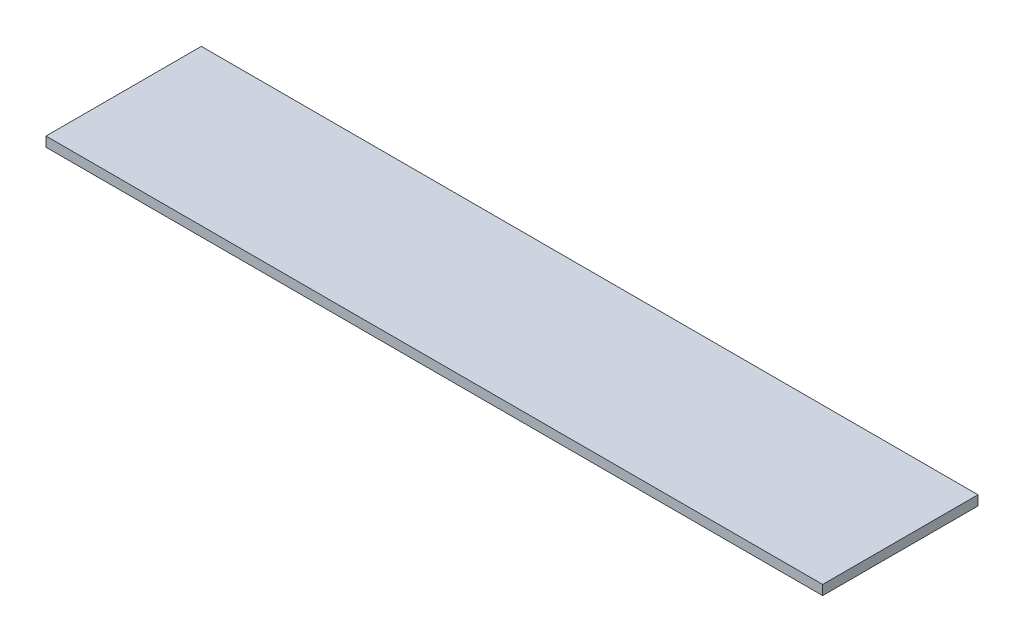
ISO-10303-21;
HEADER;
FILE_DESCRIPTION(('STEP AP214'),'2;1');
FILE_NAME('part.step','',(''),(''),'','','');
FILE_SCHEMA(('AUTOMOTIVE_DESIGN { 1 0 10303 214 1 1 1 1 }'));
ENDSEC;
DATA;
#1=APPLICATION_CONTEXT('core data for automotive mechanical design processes');
#2=APPLICATION_PROTOCOL_DEFINITION('international standard','automotive_design',2000,#1);
#3=PRODUCT_CONTEXT('',#1,'mechanical');
#4=PRODUCT('Part','Part','',(#3));
#5=PRODUCT_RELATED_PRODUCT_CATEGORY('part','',(#4));
#6=PRODUCT_DEFINITION_FORMATION('','',#4);
#7=PRODUCT_DEFINITION_CONTEXT('part definition',#1,'design');
#8=PRODUCT_DEFINITION('design','',#6,#7);
#9=PRODUCT_DEFINITION_SHAPE('','',#8);
#10=(LENGTH_UNIT() NAMED_UNIT(*) SI_UNIT(.MILLI.,.METRE.));
#11=(NAMED_UNIT(*) PLANE_ANGLE_UNIT() SI_UNIT($,.RADIAN.));
#12=(NAMED_UNIT(*) SI_UNIT($,.STERADIAN.) SOLID_ANGLE_UNIT());
#13=UNCERTAINTY_MEASURE_WITH_UNIT(LENGTH_MEASURE(1.E-05),#10,'distance_accuracy_value','');
#14=(GEOMETRIC_REPRESENTATION_CONTEXT(3) GLOBAL_UNCERTAINTY_ASSIGNED_CONTEXT((#13)) GLOBAL_UNIT_ASSIGNED_CONTEXT((#10,
#11,#12)) REPRESENTATION_CONTEXT('',''));
#15=CARTESIAN_POINT('',(0.,0.,0.));
#16=DIRECTION('',(0.,0.,1.));
#17=DIRECTION('',(1.,0.,0.));
#18=AXIS2_PLACEMENT_3D('',#15,#16,#17);
#19=CARTESIAN_POINT('',(40.,0.5,4.));
#20=DIRECTION('',(-1.,0.,0.));
#21=DIRECTION('',(0.,0.,1.));
#22=AXIS2_PLACEMENT_3D('',#19,#20,#21);
#23=PLANE('',#22);
#24=DIRECTION('',(0.,0.,-1.));
#25=VECTOR('',#24,1.);
#26=CARTESIAN_POINT('',(40.,0.,4.));
#27=LINE('',#26,#25);
#28=CARTESIAN_POINT('',(40.,0.,4.));
#29=VERTEX_POINT('',#28);
#30=CARTESIAN_POINT('',(40.,0.,-4.));
#31=VERTEX_POINT('',#30);
#32=EDGE_CURVE('E102',#29,#31,#27,.T.);
#33=ORIENTED_EDGE('',*,*,#32,.T.);
#34=DIRECTION('',(0.,-1.,0.));
#35=VECTOR('',#34,1.);
#36=CARTESIAN_POINT('',(40.,0.5,-4.));
#37=LINE('',#36,#35);
#38=CARTESIAN_POINT('',(40.,0.5,-4.));
#39=VERTEX_POINT('',#38);
#40=EDGE_CURVE('E11',#39,#31,#37,.T.);
#41=ORIENTED_EDGE('',*,*,#40,.F.);
#42=DIRECTION('',(0.,0.,-1.));
#43=VECTOR('',#42,1.);
#44=CARTESIAN_POINT('',(40.,0.5,4.));
#45=LINE('',#44,#43);
#46=CARTESIAN_POINT('',(40.,0.5,4.));
#47=VERTEX_POINT('',#46);
#48=EDGE_CURVE('E90',#47,#39,#45,.T.);
#49=ORIENTED_EDGE('',*,*,#48,.F.);
#50=DIRECTION('',(0.,-1.,0.));
#51=VECTOR('',#50,1.);
#52=CARTESIAN_POINT('',(40.,0.5,4.));
#53=LINE('',#52,#51);
#54=EDGE_CURVE('E98',#47,#29,#53,.T.);
#55=ORIENTED_EDGE('',*,*,#54,.T.);
#56=EDGE_LOOP('',(#33,#41,#49,#55));
#57=FACE_BOUND('',#56,.T.);
#58=ADVANCED_FACE('F39',(#57),#23,.F.);
#59=CARTESIAN_POINT('',(0.,0.5,-4.));
#60=DIRECTION('',(0.,0.,1.));
#61=DIRECTION('',(1.,0.,0.));
#62=AXIS2_PLACEMENT_3D('',#59,#60,#61);
#63=PLANE('',#62);
#64=DIRECTION('',(-1.,0.,0.));
#65=VECTOR('',#64,1.);
#66=CARTESIAN_POINT('',(0.,0.,-4.));
#67=LINE('',#66,#65);
#68=CARTESIAN_POINT('',(0.,0.,-4.));
#69=VERTEX_POINT('',#68);
#70=EDGE_CURVE('E94',#31,#69,#67,.T.);
#71=ORIENTED_EDGE('',*,*,#70,.T.);
#72=DIRECTION('',(0.,-1.,0.));
#73=VECTOR('',#72,1.);
#74=CARTESIAN_POINT('',(0.,0.5,-4.));
#75=LINE('',#74,#73);
#76=CARTESIAN_POINT('',(0.,0.5,-4.));
#77=VERTEX_POINT('',#76);
#78=EDGE_CURVE('E47',#77,#69,#75,.T.);
#79=ORIENTED_EDGE('',*,*,#78,.F.);
#80=DIRECTION('',(-1.,0.,0.));
#81=VECTOR('',#80,1.);
#82=CARTESIAN_POINT('',(0.,0.5,-4.));
#83=LINE('',#82,#81);
#84=EDGE_CURVE('E85',#39,#77,#83,.T.);
#85=ORIENTED_EDGE('',*,*,#84,.F.);
#86=ORIENTED_EDGE('',*,*,#40,.T.);
#87=EDGE_LOOP('',(#71,#79,#85,#86));
#88=FACE_BOUND('',#87,.T.);
#89=ADVANCED_FACE('F93',(#88),#63,.F.);
#90=CARTESIAN_POINT('',(0.,0.5,4.));
#91=DIRECTION('',(1.,0.,0.));
#92=DIRECTION('',(0.,0.,-1.));
#93=AXIS2_PLACEMENT_3D('',#90,#91,#92);
#94=PLANE('',#93);
#95=DIRECTION('',(0.,0.,1.));
#96=VECTOR('',#95,1.);
#97=CARTESIAN_POINT('',(0.,0.,4.));
#98=LINE('',#97,#96);
#99=CARTESIAN_POINT('',(0.,0.,4.));
#100=VERTEX_POINT('',#99);
#101=EDGE_CURVE('E72',#69,#100,#98,.T.);
#102=ORIENTED_EDGE('',*,*,#101,.T.);
#103=DIRECTION('',(0.,-1.,0.));
#104=VECTOR('',#103,1.);
#105=CARTESIAN_POINT('',(0.,0.5,4.));
#106=LINE('',#105,#104);
#107=CARTESIAN_POINT('',(0.,0.5,4.));
#108=VERTEX_POINT('',#107);
#109=EDGE_CURVE('E95',#108,#100,#106,.T.);
#110=ORIENTED_EDGE('',*,*,#109,.F.);
#111=DIRECTION('',(0.,0.,1.));
#112=VECTOR('',#111,1.);
#113=CARTESIAN_POINT('',(0.,0.5,4.));
#114=LINE('',#113,#112);
#115=EDGE_CURVE('E88',#77,#108,#114,.T.);
#116=ORIENTED_EDGE('',*,*,#115,.F.);
#117=ORIENTED_EDGE('',*,*,#78,.T.);
#118=EDGE_LOOP('',(#102,#110,#116,#117));
#119=FACE_BOUND('',#118,.T.);
#120=ADVANCED_FACE('F96',(#119),#94,.F.);
#121=CARTESIAN_POINT('',(0.,0.5,4.));
#122=DIRECTION('',(0.,0.,-1.));
#123=DIRECTION('',(-1.,0.,0.));
#124=AXIS2_PLACEMENT_3D('',#121,#122,#123);
#125=PLANE('',#124);
#126=DIRECTION('',(1.,0.,0.));
#127=VECTOR('',#126,1.);
#128=CARTESIAN_POINT('',(0.,0.,4.));
#129=LINE('',#128,#127);
#130=EDGE_CURVE('E78',#100,#29,#129,.T.);
#131=ORIENTED_EDGE('',*,*,#130,.T.);
#132=ORIENTED_EDGE('',*,*,#54,.F.);
#133=DIRECTION('',(1.,0.,0.));
#134=VECTOR('',#133,1.);
#135=CARTESIAN_POINT('',(0.,0.5,4.));
#136=LINE('',#135,#134);
#137=EDGE_CURVE('E55',#108,#47,#136,.T.);
#138=ORIENTED_EDGE('',*,*,#137,.F.);
#139=ORIENTED_EDGE('',*,*,#109,.T.);
#140=EDGE_LOOP('',(#131,#132,#138,#139));
#141=FACE_BOUND('',#140,.T.);
#142=ADVANCED_FACE('F109',(#141),#125,.F.);
#143=CARTESIAN_POINT('',(0.,0.5,0.));
#144=DIRECTION('',(0.,-1.,0.));
#145=DIRECTION('',(0.,0.,-1.));
#146=AXIS2_PLACEMENT_3D('',#143,#144,#145);
#147=PLANE('',#146);
#148=ORIENTED_EDGE('',*,*,#48,.T.);
#149=ORIENTED_EDGE('',*,*,#84,.T.);
#150=ORIENTED_EDGE('',*,*,#115,.T.);
#151=ORIENTED_EDGE('',*,*,#137,.T.);
#152=EDGE_LOOP('',(#148,#149,#150,#151));
#153=FACE_BOUND('',#152,.T.);
#154=ADVANCED_FACE('F86',(#153),#147,.F.);
#155=CARTESIAN_POINT('',(0.,0.,0.));
#156=DIRECTION('',(0.,-1.,0.));
#157=DIRECTION('',(0.,0.,-1.));
#158=AXIS2_PLACEMENT_3D('',#155,#156,#157);
#159=PLANE('',#158);
#160=ORIENTED_EDGE('',*,*,#32,.F.);
#161=ORIENTED_EDGE('',*,*,#130,.F.);
#162=ORIENTED_EDGE('',*,*,#101,.F.);
#163=ORIENTED_EDGE('',*,*,#70,.F.);
#164=EDGE_LOOP('',(#160,#161,#162,#163));
#165=FACE_BOUND('',#164,.T.);
#166=ADVANCED_FACE('F112',(#165),#159,.T.);
#167=CLOSED_SHELL('',(#58,#89,#120,#142,#154,#166));
#168=MANIFOLD_SOLID_BREP('B2',#167);
#169=ADVANCED_BREP_SHAPE_REPRESENTATION('',(#18,#168),#14);
#170=SHAPE_DEFINITION_REPRESENTATION(#9,#169);
ENDSEC;
END-ISO-10303-21;
